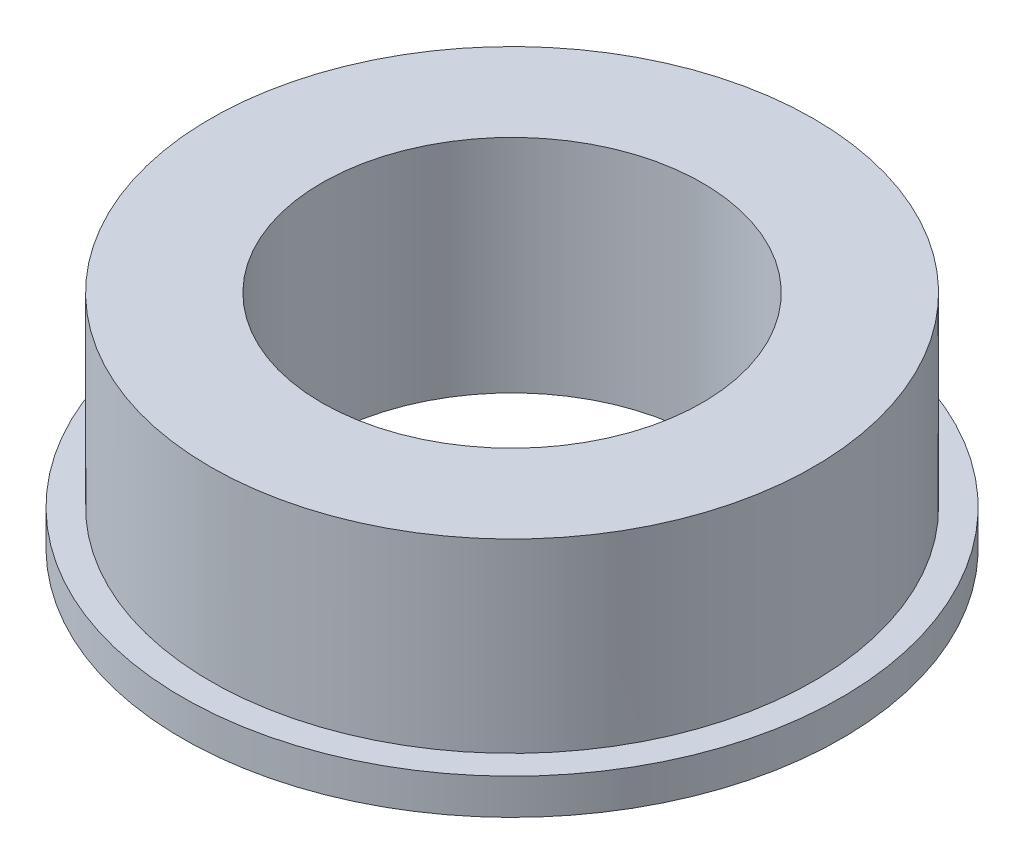
ISO-10303-21;
HEADER;
FILE_DESCRIPTION(('STEP AP214'),'2;1');
FILE_NAME('part.step','',(''),(''),'','','');
FILE_SCHEMA(('AUTOMOTIVE_DESIGN { 1 0 10303 214 1 1 1 1 }'));
ENDSEC;
DATA;
#1=APPLICATION_CONTEXT('core data for automotive mechanical design processes');
#2=APPLICATION_PROTOCOL_DEFINITION('international standard','automotive_design',2000,#1);
#3=PRODUCT_CONTEXT('',#1,'mechanical');
#4=PRODUCT('Part','Part','',(#3));
#5=PRODUCT_RELATED_PRODUCT_CATEGORY('part','',(#4));
#6=PRODUCT_DEFINITION_FORMATION('','',#4);
#7=PRODUCT_DEFINITION_CONTEXT('part definition',#1,'design');
#8=PRODUCT_DEFINITION('design','',#6,#7);
#9=PRODUCT_DEFINITION_SHAPE('','',#8);
#10=(LENGTH_UNIT() NAMED_UNIT(*) SI_UNIT(.MILLI.,.METRE.));
#11=(NAMED_UNIT(*) PLANE_ANGLE_UNIT() SI_UNIT($,.RADIAN.));
#12=(NAMED_UNIT(*) SI_UNIT($,.STERADIAN.) SOLID_ANGLE_UNIT());
#13=UNCERTAINTY_MEASURE_WITH_UNIT(LENGTH_MEASURE(1.E-05),#10,'distance_accuracy_value','');
#14=(GEOMETRIC_REPRESENTATION_CONTEXT(3) GLOBAL_UNCERTAINTY_ASSIGNED_CONTEXT((#13)) GLOBAL_UNIT_ASSIGNED_CONTEXT((#10,
#11,#12)) REPRESENTATION_CONTEXT('',''));
#15=CARTESIAN_POINT('',(0.,0.,0.));
#16=DIRECTION('',(0.,0.,1.));
#17=DIRECTION('',(1.,0.,0.));
#18=AXIS2_PLACEMENT_3D('',#15,#16,#17);
#19=CARTESIAN_POINT('',(0.,4.65,0.));
#20=DIRECTION('',(0.,-1.,0.));
#21=DIRECTION('',(0.,0.,-1.));
#22=AXIS2_PLACEMENT_3D('',#19,#20,#21);
#23=CYLINDRICAL_SURFACE('',#22,6.3373);
#24=CARTESIAN_POINT('',(0.,4.65,0.));
#25=DIRECTION('',(0.,1.,0.));
#26=DIRECTION('',(0.,0.,1.));
#27=AXIS2_PLACEMENT_3D('',#24,#25,#26);
#28=CIRCLE('',#27,6.3373);
#29=CARTESIAN_POINT('',(0.,4.65,6.3373));
#30=VERTEX_POINT('',#29);
#31=EDGE_CURVE('E35',#30,#30,#28,.T.);
#32=ORIENTED_EDGE('',*,*,#31,.F.);
#33=EDGE_LOOP('',(#32));
#34=FACE_BOUND('',#33,.T.);
#35=CARTESIAN_POINT('',(0.,0.75,0.));
#36=DIRECTION('',(0.,-1.,0.));
#37=DIRECTION('',(0.,0.,-1.));
#38=AXIS2_PLACEMENT_3D('',#35,#36,#37);
#39=CIRCLE('',#38,6.3373);
#40=CARTESIAN_POINT('',(0.,0.75,-6.3373));
#41=VERTEX_POINT('',#40);
#42=EDGE_CURVE('E10',#41,#41,#39,.T.);
#43=ORIENTED_EDGE('',*,*,#42,.F.);
#44=EDGE_LOOP('',(#43));
#45=FACE_BOUND('',#44,.T.);
#46=ADVANCED_FACE('F32',(#34,#45),#23,.T.);
#47=CARTESIAN_POINT('',(0.,4.65,0.));
#48=DIRECTION('',(0.,1.,0.));
#49=DIRECTION('',(0.,0.,1.));
#50=AXIS2_PLACEMENT_3D('',#47,#48,#49);
#51=PLANE('',#50);
#52=ORIENTED_EDGE('',*,*,#31,.T.);
#53=EDGE_LOOP('',(#52));
#54=FACE_BOUND('',#53,.T.);
#55=CARTESIAN_POINT('',(0.,4.65,0.));
#56=DIRECTION('',(0.,1.,0.));
#57=DIRECTION('',(0.,0.,1.));
#58=AXIS2_PLACEMENT_3D('',#55,#56,#57);
#59=CIRCLE('',#58,4.);
#60=CARTESIAN_POINT('',(0.,4.65,4.));
#61=VERTEX_POINT('',#60);
#62=EDGE_CURVE('E43',#61,#61,#59,.T.);
#63=ORIENTED_EDGE('',*,*,#62,.F.);
#64=EDGE_LOOP('',(#63));
#65=FACE_BOUND('',#64,.T.);
#66=ADVANCED_FACE('F74',(#54,#65),#51,.T.);
#67=CARTESIAN_POINT('',(0.,0.,0.));
#68=DIRECTION('',(0.,1.,0.));
#69=DIRECTION('',(0.,0.,1.));
#70=AXIS2_PLACEMENT_3D('',#67,#68,#69);
#71=PLANE('',#70);
#72=CARTESIAN_POINT('',(0.,0.,0.));
#73=DIRECTION('',(0.,1.,0.));
#74=DIRECTION('',(0.,0.,1.));
#75=AXIS2_PLACEMENT_3D('',#72,#73,#74);
#76=CIRCLE('',#75,4.);
#77=CARTESIAN_POINT('',(0.,0.,4.));
#78=VERTEX_POINT('',#77);
#79=EDGE_CURVE('E49',#78,#78,#76,.T.);
#80=ORIENTED_EDGE('',*,*,#79,.T.);
#81=EDGE_LOOP('',(#80));
#82=FACE_BOUND('',#81,.T.);
#83=CARTESIAN_POINT('',(0.,0.,0.));
#84=DIRECTION('',(0.,-1.,0.));
#85=DIRECTION('',(0.,0.,-1.));
#86=AXIS2_PLACEMENT_3D('',#83,#84,#85);
#87=CIRCLE('',#86,6.925);
#88=CARTESIAN_POINT('',(0.,0.,-6.925));
#89=VERTEX_POINT('',#88);
#90=EDGE_CURVE('E46',#89,#89,#87,.T.);
#91=ORIENTED_EDGE('',*,*,#90,.T.);
#92=EDGE_LOOP('',(#91));
#93=FACE_BOUND('',#92,.T.);
#94=ADVANCED_FACE('F60',(#82,#93),#71,.F.);
#95=CARTESIAN_POINT('',(0.,4.65,0.));
#96=DIRECTION('',(0.,-1.,0.));
#97=DIRECTION('',(0.,0.,-1.));
#98=AXIS2_PLACEMENT_3D('',#95,#96,#97);
#99=CYLINDRICAL_SURFACE('',#98,4.);
#100=ORIENTED_EDGE('',*,*,#79,.F.);
#101=EDGE_LOOP('',(#100));
#102=FACE_BOUND('',#101,.T.);
#103=ORIENTED_EDGE('',*,*,#62,.T.);
#104=EDGE_LOOP('',(#103));
#105=FACE_BOUND('',#104,.T.);
#106=ADVANCED_FACE('F69',(#102,#105),#99,.F.);
#107=CARTESIAN_POINT('',(0.,0.75,0.));
#108=DIRECTION('',(0.,-1.,0.));
#109=DIRECTION('',(0.,0.,-1.));
#110=AXIS2_PLACEMENT_3D('',#107,#108,#109);
#111=PLANE('',#110);
#112=CARTESIAN_POINT('',(0.,0.75,0.));
#113=DIRECTION('',(0.,-1.,0.));
#114=DIRECTION('',(0.,0.,-1.));
#115=AXIS2_PLACEMENT_3D('',#112,#113,#114);
#116=CIRCLE('',#115,6.925);
#117=CARTESIAN_POINT('',(0.,0.75,-6.925));
#118=VERTEX_POINT('',#117);
#119=EDGE_CURVE('E51',#118,#118,#116,.T.);
#120=ORIENTED_EDGE('',*,*,#119,.F.);
#121=EDGE_LOOP('',(#120));
#122=FACE_BOUND('',#121,.T.);
#123=ORIENTED_EDGE('',*,*,#42,.T.);
#124=EDGE_LOOP('',(#123));
#125=FACE_BOUND('',#124,.T.);
#126=ADVANCED_FACE('F64',(#122,#125),#111,.F.);
#127=CARTESIAN_POINT('',(0.,0.75,0.));
#128=DIRECTION('',(0.,-1.,0.));
#129=DIRECTION('',(0.,0.,-1.));
#130=AXIS2_PLACEMENT_3D('',#127,#128,#129);
#131=CYLINDRICAL_SURFACE('',#130,6.925);
#132=ORIENTED_EDGE('',*,*,#119,.T.);
#133=EDGE_LOOP('',(#132));
#134=FACE_BOUND('',#133,.T.);
#135=ORIENTED_EDGE('',*,*,#90,.F.);
#136=EDGE_LOOP('',(#135));
#137=FACE_BOUND('',#136,.T.);
#138=ADVANCED_FACE('F62',(#134,#137),#131,.T.);
#139=CLOSED_SHELL('',(#46,#66,#94,#106,#126,#138));
#140=MANIFOLD_SOLID_BREP('B2',#139);
#141=ADVANCED_BREP_SHAPE_REPRESENTATION('',(#18,#140),#14);
#142=SHAPE_DEFINITION_REPRESENTATION(#9,#141);
ENDSEC;
END-ISO-10303-21;
